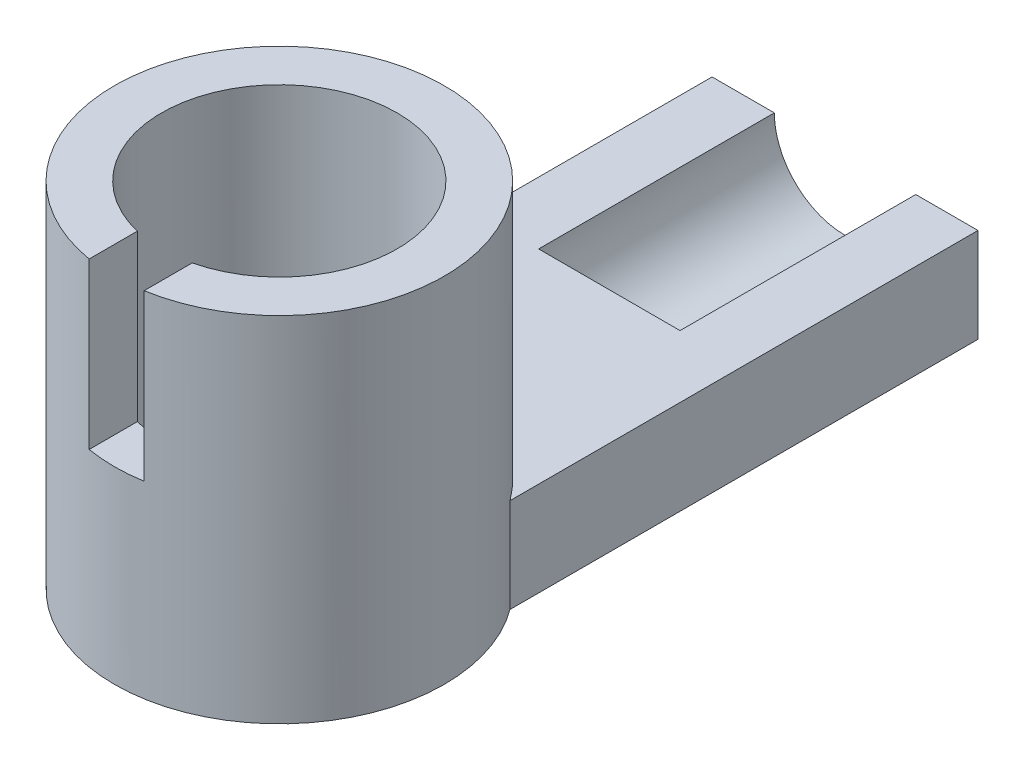
ISO-10303-21;
HEADER;
FILE_DESCRIPTION(('STEP AP214'),'2;1');
FILE_NAME('part.step','',(''),(''),'','','');
FILE_SCHEMA(('AUTOMOTIVE_DESIGN { 1 0 10303 214 1 1 1 1 }'));
ENDSEC;
DATA;
#1=APPLICATION_CONTEXT('core data for automotive mechanical design processes');
#2=APPLICATION_PROTOCOL_DEFINITION('international standard','automotive_design',2000,#1);
#3=PRODUCT_CONTEXT('',#1,'mechanical');
#4=PRODUCT('Part','Part','',(#3));
#5=PRODUCT_RELATED_PRODUCT_CATEGORY('part','',(#4));
#6=PRODUCT_DEFINITION_FORMATION('','',#4);
#7=PRODUCT_DEFINITION_CONTEXT('part definition',#1,'design');
#8=PRODUCT_DEFINITION('design','',#6,#7);
#9=PRODUCT_DEFINITION_SHAPE('','',#8);
#10=(LENGTH_UNIT() NAMED_UNIT(*) SI_UNIT(.MILLI.,.METRE.));
#11=(NAMED_UNIT(*) PLANE_ANGLE_UNIT() SI_UNIT($,.RADIAN.));
#12=(NAMED_UNIT(*) SI_UNIT($,.STERADIAN.) SOLID_ANGLE_UNIT());
#13=UNCERTAINTY_MEASURE_WITH_UNIT(LENGTH_MEASURE(1.E-05),#10,'distance_accuracy_value','');
#14=(GEOMETRIC_REPRESENTATION_CONTEXT(3) GLOBAL_UNCERTAINTY_ASSIGNED_CONTEXT((#13)) GLOBAL_UNIT_ASSIGNED_CONTEXT((#10,
#11,#12)) REPRESENTATION_CONTEXT('',''));
#15=CARTESIAN_POINT('',(0.,0.,0.));
#16=DIRECTION('',(0.,0.,1.));
#17=DIRECTION('',(1.,0.,0.));
#18=AXIS2_PLACEMENT_3D('',#15,#16,#17);
#19=CARTESIAN_POINT('',(0.,150000.,0.));
#20=DIRECTION('',(0.,1.,0.));
#21=DIRECTION('',(0.,0.,1.));
#22=AXIS2_PLACEMENT_3D('',#19,#20,#21);
#23=PLANE('',#22);
#24=CARTESIAN_POINT('',(0.,150000.,0.));
#25=DIRECTION('',(0.,1.,0.));
#26=DIRECTION('',(0.,0.,1.));
#27=AXIS2_PLACEMENT_3D('',#24,#25,#26);
#28=CIRCLE('',#27,50000.);
#29=CARTESIAN_POINT('',(11658.732966895,150000.,48621.74354758));
#30=VERTEX_POINT('',#29);
#31=CARTESIAN_POINT('',(-11658.732966895,150000.,48621.74354758));
#32=VERTEX_POINT('',#31);
#33=EDGE_CURVE('E172',#30,#32,#28,.T.);
#34=ORIENTED_EDGE('',*,*,#33,.F.);
#35=DIRECTION('',(0.,0.,1.));
#36=VECTOR('',#35,1.);
#37=CARTESIAN_POINT('',(11658.732966895,150000.,0.));
#38=LINE('',#37,#36);
#39=CARTESIAN_POINT('',(11658.732966895,150000.,69022.271373859));
#40=VERTEX_POINT('',#39);
#41=EDGE_CURVE('E129',#30,#40,#38,.T.);
#42=ORIENTED_EDGE('',*,*,#41,.T.);
#43=CARTESIAN_POINT('',(0.,150000.,0.));
#44=DIRECTION('',(0.,1.,0.));
#45=DIRECTION('',(0.,0.,1.));
#46=AXIS2_PLACEMENT_3D('',#43,#44,#45);
#47=CIRCLE('',#46,70000.);
#48=CARTESIAN_POINT('',(-11658.732966895,150000.,69022.271373859));
#49=VERTEX_POINT('',#48);
#50=EDGE_CURVE('E127',#40,#49,#47,.T.);
#51=ORIENTED_EDGE('',*,*,#50,.T.);
#52=DIRECTION('',(0.,0.,-1.));
#53=VECTOR('',#52,1.);
#54=CARTESIAN_POINT('',(-11658.732966895,150000.,0.));
#55=LINE('',#54,#53);
#56=EDGE_CURVE('E117',#49,#32,#55,.T.);
#57=ORIENTED_EDGE('',*,*,#56,.T.);
#58=EDGE_LOOP('',(#34,#42,#51,#57));
#59=FACE_BOUND('',#58,.T.);
#60=ADVANCED_FACE('F33',(#59),#23,.T.);
#61=CARTESIAN_POINT('',(0.,150000.,0.));
#62=DIRECTION('',(0.,-1.,0.));
#63=DIRECTION('',(0.,0.,-1.));
#64=AXIS2_PLACEMENT_3D('',#61,#62,#63);
#65=CYLINDRICAL_SURFACE('',#64,70000.);
#66=CARTESIAN_POINT('',(0.,40000.,0.));
#67=DIRECTION('',(0.,1.,0.));
#68=DIRECTION('',(0.,0.,1.));
#69=AXIS2_PLACEMENT_3D('',#66,#67,#68);
#70=CIRCLE('',#69,70000.);
#71=CARTESIAN_POINT('',(56411.2858654656,40000.,-41445.95067078));
#72=VERTEX_POINT('',#71);
#73=CARTESIAN_POINT('',(-56411.2858654656,40000.,-41445.95067078));
#74=VERTEX_POINT('',#73);
#75=EDGE_CURVE('E162',#72,#74,#70,.T.);
#76=ORIENTED_EDGE('',*,*,#75,.T.);
#77=DIRECTION('',(0.,-1.,0.));
#78=VECTOR('',#77,1.);
#79=CARTESIAN_POINT('',(-56411.2858654656,40000.,-41445.95067078));
#80=LINE('',#79,#78);
#81=CARTESIAN_POINT('',(-56411.2858654656,0.,-41445.95067078));
#82=VERTEX_POINT('',#81);
#83=EDGE_CURVE('E165',#74,#82,#80,.T.);
#84=ORIENTED_EDGE('',*,*,#83,.T.);
#85=CARTESIAN_POINT('',(0.,0.,0.));
#86=DIRECTION('',(0.,1.,0.));
#87=DIRECTION('',(0.,0.,1.));
#88=AXIS2_PLACEMENT_3D('',#85,#86,#87);
#89=CIRCLE('',#88,70000.);
#90=CARTESIAN_POINT('',(56411.2858654656,0.,-41445.95067078));
#91=VERTEX_POINT('',#90);
#92=EDGE_CURVE('E175',#82,#91,#89,.T.);
#93=ORIENTED_EDGE('',*,*,#92,.T.);
#94=DIRECTION('',(0.,-1.,0.));
#95=VECTOR('',#94,1.);
#96=CARTESIAN_POINT('',(56411.2858654656,40000.,-41445.95067078));
#97=LINE('',#96,#95);
#98=EDGE_CURVE('E152',#72,#91,#97,.T.);
#99=ORIENTED_EDGE('',*,*,#98,.F.);
#100=EDGE_LOOP('',(#76,#84,#93,#99));
#101=FACE_BOUND('',#100,.T.);
#102=DIRECTION('',(0.,-1.,0.));
#103=VECTOR('',#102,1.);
#104=CARTESIAN_POINT('',(11658.732966895,150000.,69022.271373859));
#105=LINE('',#104,#103);
#106=CARTESIAN_POINT('',(11658.732966895,79999.9999999998,69022.271373859));
#107=VERTEX_POINT('',#106);
#108=EDGE_CURVE('E121',#107,#40,#105,.F.);
#109=ORIENTED_EDGE('',*,*,#108,.F.);
#110=CARTESIAN_POINT('',(0.,79999.9999999998,0.));
#111=DIRECTION('',(0.,1.,0.));
#112=DIRECTION('',(0.,0.,1.));
#113=AXIS2_PLACEMENT_3D('',#110,#111,#112);
#114=CIRCLE('',#113,70000.);
#115=CARTESIAN_POINT('',(-11658.732966895,79999.9999999998,69022.271373859));
#116=VERTEX_POINT('',#115);
#117=EDGE_CURVE('E110',#116,#107,#114,.T.);
#118=ORIENTED_EDGE('',*,*,#117,.F.);
#119=DIRECTION('',(0.,-1.,0.));
#120=VECTOR('',#119,1.);
#121=CARTESIAN_POINT('',(-11658.732966895,150000.,69022.271373859));
#122=LINE('',#121,#120);
#123=EDGE_CURVE('E134',#49,#116,#122,.T.);
#124=ORIENTED_EDGE('',*,*,#123,.F.);
#125=ORIENTED_EDGE('',*,*,#50,.F.);
#126=EDGE_LOOP('',(#109,#118,#124,#125));
#127=FACE_BOUND('',#126,.T.);
#128=ADVANCED_FACE('F35',(#101,#127),#65,.T.);
#129=CARTESIAN_POINT('',(0.,150000.,0.));
#130=DIRECTION('',(0.,-1.,0.));
#131=DIRECTION('',(0.,0.,-1.));
#132=AXIS2_PLACEMENT_3D('',#129,#130,#131);
#133=CYLINDRICAL_SURFACE('',#132,50000.);
#134=CARTESIAN_POINT('',(0.,0.,0.));
#135=DIRECTION('',(0.,1.,0.));
#136=DIRECTION('',(0.,0.,1.));
#137=AXIS2_PLACEMENT_3D('',#134,#135,#136);
#138=CIRCLE('',#137,50000.);
#139=CARTESIAN_POINT('',(0.,0.,50000.));
#140=VERTEX_POINT('',#139);
#141=EDGE_CURVE('E171',#140,#140,#138,.T.);
#142=ORIENTED_EDGE('',*,*,#141,.F.);
#143=EDGE_LOOP('',(#142));
#144=FACE_BOUND('',#143,.T.);
#145=CARTESIAN_POINT('',(0.,79999.9999999998,0.));
#146=DIRECTION('',(0.,1.,0.));
#147=DIRECTION('',(0.,0.,1.));
#148=AXIS2_PLACEMENT_3D('',#145,#146,#147);
#149=CIRCLE('',#148,50000.);
#150=CARTESIAN_POINT('',(-11658.732966895,79999.9999999998,48621.74354758));
#151=VERTEX_POINT('',#150);
#152=CARTESIAN_POINT('',(11658.732966895,79999.9999999998,48621.74354758));
#153=VERTEX_POINT('',#152);
#154=EDGE_CURVE('E185',#151,#153,#149,.T.);
#155=ORIENTED_EDGE('',*,*,#154,.T.);
#156=DIRECTION('',(0.,-1.,0.));
#157=VECTOR('',#156,1.);
#158=CARTESIAN_POINT('',(11658.732966895,150000.,48621.74354758));
#159=LINE('',#158,#157);
#160=EDGE_CURVE('E11',#153,#30,#159,.F.);
#161=ORIENTED_EDGE('',*,*,#160,.T.);
#162=ORIENTED_EDGE('',*,*,#33,.T.);
#163=DIRECTION('',(0.,-1.,0.));
#164=VECTOR('',#163,1.);
#165=CARTESIAN_POINT('',(-11658.732966895,150000.,48621.74354758));
#166=LINE('',#165,#164);
#167=EDGE_CURVE('E41',#32,#151,#166,.T.);
#168=ORIENTED_EDGE('',*,*,#167,.T.);
#169=EDGE_LOOP('',(#155,#161,#162,#168));
#170=FACE_BOUND('',#169,.T.);
#171=ADVANCED_FACE('F188',(#144,#170),#133,.F.);
#172=CARTESIAN_POINT('',(0.,0.,0.));
#173=DIRECTION('',(0.,1.,0.));
#174=DIRECTION('',(0.,0.,1.));
#175=AXIS2_PLACEMENT_3D('',#172,#173,#174);
#176=PLANE('',#175);
#177=ORIENTED_EDGE('',*,*,#92,.F.);
#178=DIRECTION('',(0.,0.,-1.));
#179=VECTOR('',#178,1.);
#180=CARTESIAN_POINT('',(-56411.2858654656,0.,-240003.737633043));
#181=LINE('',#180,#179);
#182=CARTESIAN_POINT('',(-56411.2858654656,0.,-240003.737633043));
#183=VERTEX_POINT('',#182);
#184=EDGE_CURVE('E155',#82,#183,#181,.T.);
#185=ORIENTED_EDGE('',*,*,#184,.T.);
#186=DIRECTION('',(1.,0.,0.));
#187=VECTOR('',#186,1.);
#188=CARTESIAN_POINT('',(-56411.2858654656,0.,-240003.737633043));
#189=LINE('',#188,#187);
#190=CARTESIAN_POINT('',(56411.2858654656,0.,-240003.737633043));
#191=VERTEX_POINT('',#190);
#192=EDGE_CURVE('E145',#183,#191,#189,.T.);
#193=ORIENTED_EDGE('',*,*,#192,.T.);
#194=DIRECTION('',(0.,0.,1.));
#195=VECTOR('',#194,1.);
#196=CARTESIAN_POINT('',(56411.2858654656,0.,-240003.737633043));
#197=LINE('',#196,#195);
#198=EDGE_CURVE('E140',#191,#91,#197,.T.);
#199=ORIENTED_EDGE('',*,*,#198,.T.);
#200=EDGE_LOOP('',(#177,#185,#193,#199));
#201=FACE_BOUND('',#200,.T.);
#202=ORIENTED_EDGE('',*,*,#141,.T.);
#203=EDGE_LOOP('',(#202));
#204=FACE_BOUND('',#203,.T.);
#205=ADVANCED_FACE('F204',(#201,#204),#176,.F.);
#206=CARTESIAN_POINT('',(0.,40000.,0.));
#207=DIRECTION('',(0.,1.,0.));
#208=DIRECTION('',(0.,0.,1.));
#209=AXIS2_PLACEMENT_3D('',#206,#207,#208);
#210=PLANE('',#209);
#211=DIRECTION('',(0.,0.,-1.));
#212=VECTOR('',#211,1.);
#213=CARTESIAN_POINT('',(30000.,40000.,-140003.737633043));
#214=LINE('',#213,#212);
#215=CARTESIAN_POINT('',(30000.,40000.,-140003.737633043));
#216=VERTEX_POINT('',#215);
#217=CARTESIAN_POINT('',(30000.,40000.,-240003.737633043));
#218=VERTEX_POINT('',#217);
#219=EDGE_CURVE('E56',#216,#218,#214,.T.);
#220=ORIENTED_EDGE('',*,*,#219,.F.);
#221=DIRECTION('',(-1.,0.,0.));
#222=VECTOR('',#221,1.);
#223=CARTESIAN_POINT('',(0.,40000.,-140003.737633043));
#224=LINE('',#223,#222);
#225=CARTESIAN_POINT('',(-30000.,40000.,-140003.737633043));
#226=VERTEX_POINT('',#225);
#227=EDGE_CURVE('E182',#216,#226,#224,.T.);
#228=ORIENTED_EDGE('',*,*,#227,.T.);
#229=DIRECTION('',(0.,0.,-1.));
#230=VECTOR('',#229,1.);
#231=CARTESIAN_POINT('',(-30000.,40000.,-140003.737633043));
#232=LINE('',#231,#230);
#233=CARTESIAN_POINT('',(-30000.,40000.,-240003.737633043));
#234=VERTEX_POINT('',#233);
#235=EDGE_CURVE('E132',#234,#226,#232,.F.);
#236=ORIENTED_EDGE('',*,*,#235,.F.);
#237=DIRECTION('',(1.,0.,0.));
#238=VECTOR('',#237,1.);
#239=CARTESIAN_POINT('',(-56411.2858654656,40000.,-240003.737633043));
#240=LINE('',#239,#238);
#241=CARTESIAN_POINT('',(-56411.2858654656,40000.,-240003.737633043));
#242=VERTEX_POINT('',#241);
#243=EDGE_CURVE('E149',#242,#234,#240,.T.);
#244=ORIENTED_EDGE('',*,*,#243,.F.);
#245=DIRECTION('',(0.,0.,-1.));
#246=VECTOR('',#245,1.);
#247=CARTESIAN_POINT('',(-56411.2858654656,40000.,-240003.737633043));
#248=LINE('',#247,#246);
#249=EDGE_CURVE('E144',#74,#242,#248,.T.);
#250=ORIENTED_EDGE('',*,*,#249,.F.);
#251=ORIENTED_EDGE('',*,*,#75,.F.);
#252=DIRECTION('',(0.,0.,1.));
#253=VECTOR('',#252,1.);
#254=CARTESIAN_POINT('',(56411.2858654656,40000.,-240003.737633043));
#255=LINE('',#254,#253);
#256=CARTESIAN_POINT('',(56411.2858654656,40000.,-240003.737633043));
#257=VERTEX_POINT('',#256);
#258=EDGE_CURVE('E141',#257,#72,#255,.T.);
#259=ORIENTED_EDGE('',*,*,#258,.F.);
#260=EDGE_CURVE('E148',#218,#257,#240,.T.);
#261=ORIENTED_EDGE('',*,*,#260,.F.);
#262=EDGE_LOOP('',(#220,#228,#236,#244,#250,#251,#259,#261));
#263=FACE_BOUND('',#262,.T.);
#264=ADVANCED_FACE('F206',(#263),#210,.T.);
#265=CARTESIAN_POINT('',(56411.2858654656,40000.,-240003.737633043));
#266=DIRECTION('',(1.,0.,0.));
#267=DIRECTION('',(0.,0.,-1.));
#268=AXIS2_PLACEMENT_3D('',#265,#266,#267);
#269=PLANE('',#268);
#270=ORIENTED_EDGE('',*,*,#198,.F.);
#271=DIRECTION('',(0.,-1.,0.));
#272=VECTOR('',#271,1.);
#273=CARTESIAN_POINT('',(56411.2858654656,40000.,-240003.737633043));
#274=LINE('',#273,#272);
#275=EDGE_CURVE('E160',#257,#191,#274,.T.);
#276=ORIENTED_EDGE('',*,*,#275,.F.);
#277=ORIENTED_EDGE('',*,*,#258,.T.);
#278=ORIENTED_EDGE('',*,*,#98,.T.);
#279=EDGE_LOOP('',(#270,#276,#277,#278));
#280=FACE_BOUND('',#279,.T.);
#281=ADVANCED_FACE('F212',(#280),#269,.T.);
#282=CARTESIAN_POINT('',(-56411.2858654656,40000.,-240003.737633043));
#283=DIRECTION('',(0.,0.,-1.));
#284=DIRECTION('',(-1.,0.,0.));
#285=AXIS2_PLACEMENT_3D('',#282,#283,#284);
#286=PLANE('',#285);
#287=CARTESIAN_POINT('',(0.,40000.,-240003.737633043));
#288=DIRECTION('',(0.,0.,-1.));
#289=DIRECTION('',(-1.,0.,0.));
#290=AXIS2_PLACEMENT_3D('',#287,#288,#289);
#291=CIRCLE('',#290,30000.);
#292=EDGE_CURVE('E179',#218,#234,#291,.T.);
#293=ORIENTED_EDGE('',*,*,#292,.F.);
#294=ORIENTED_EDGE('',*,*,#260,.T.);
#295=ORIENTED_EDGE('',*,*,#275,.T.);
#296=ORIENTED_EDGE('',*,*,#192,.F.);
#297=DIRECTION('',(0.,-1.,0.));
#298=VECTOR('',#297,1.);
#299=CARTESIAN_POINT('',(-56411.2858654656,40000.,-240003.737633043));
#300=LINE('',#299,#298);
#301=EDGE_CURVE('E163',#242,#183,#300,.T.);
#302=ORIENTED_EDGE('',*,*,#301,.F.);
#303=ORIENTED_EDGE('',*,*,#243,.T.);
#304=EDGE_LOOP('',(#293,#294,#295,#296,#302,#303));
#305=FACE_BOUND('',#304,.T.);
#306=ADVANCED_FACE('F228',(#305),#286,.T.);
#307=CARTESIAN_POINT('',(-56411.2858654656,40000.,-240003.737633043));
#308=DIRECTION('',(-1.,0.,0.));
#309=DIRECTION('',(0.,0.,1.));
#310=AXIS2_PLACEMENT_3D('',#307,#308,#309);
#311=PLANE('',#310);
#312=ORIENTED_EDGE('',*,*,#184,.F.);
#313=ORIENTED_EDGE('',*,*,#83,.F.);
#314=ORIENTED_EDGE('',*,*,#249,.T.);
#315=ORIENTED_EDGE('',*,*,#301,.T.);
#316=EDGE_LOOP('',(#312,#313,#314,#315));
#317=FACE_BOUND('',#316,.T.);
#318=ADVANCED_FACE('F225',(#317),#311,.T.);
#319=CARTESIAN_POINT('',(0.,40000.,-140003.737633043));
#320=DIRECTION('',(0.,0.,-1.));
#321=DIRECTION('',(-1.,0.,0.));
#322=AXIS2_PLACEMENT_3D('',#319,#320,#321);
#323=CYLINDRICAL_SURFACE('',#322,30000.);
#324=ORIENTED_EDGE('',*,*,#219,.T.);
#325=ORIENTED_EDGE('',*,*,#292,.T.);
#326=ORIENTED_EDGE('',*,*,#235,.T.);
#327=CARTESIAN_POINT('',(0.,40000.,-140003.737633043));
#328=DIRECTION('',(0.,0.,-1.));
#329=DIRECTION('',(-1.,0.,0.));
#330=AXIS2_PLACEMENT_3D('',#327,#328,#329);
#331=CIRCLE('',#330,30000.);
#332=EDGE_CURVE('E128',#216,#226,#331,.T.);
#333=ORIENTED_EDGE('',*,*,#332,.F.);
#334=EDGE_LOOP('',(#324,#325,#326,#333));
#335=FACE_BOUND('',#334,.T.);
#336=ADVANCED_FACE('F234',(#335),#323,.F.);
#337=CARTESIAN_POINT('',(0.,40000.,-140003.737633043));
#338=DIRECTION('',(0.,0.,-1.));
#339=DIRECTION('',(-1.,0.,0.));
#340=AXIS2_PLACEMENT_3D('',#337,#338,#339);
#341=PLANE('',#340);
#342=ORIENTED_EDGE('',*,*,#332,.T.);
#343=ORIENTED_EDGE('',*,*,#227,.F.);
#344=EDGE_LOOP('',(#342,#343));
#345=FACE_BOUND('',#344,.T.);
#346=ADVANCED_FACE('F236',(#345),#341,.T.);
#347=CARTESIAN_POINT('',(11658.732966895,193724.,-20000.));
#348=DIRECTION('',(-1.,0.,0.));
#349=DIRECTION('',(0.,0.,1.));
#350=AXIS2_PLACEMENT_3D('',#347,#348,#349);
#351=PLANE('',#350);
#352=ORIENTED_EDGE('',*,*,#108,.T.);
#353=ORIENTED_EDGE('',*,*,#41,.F.);
#354=ORIENTED_EDGE('',*,*,#160,.F.);
#355=DIRECTION('',(0.,0.,-1.));
#356=VECTOR('',#355,1.);
#357=CARTESIAN_POINT('',(11658.732966895,79999.9999999998,-20000.));
#358=LINE('',#357,#356);
#359=EDGE_CURVE('E48',#107,#153,#358,.T.);
#360=ORIENTED_EDGE('',*,*,#359,.F.);
#361=EDGE_LOOP('',(#352,#353,#354,#360));
#362=FACE_BOUND('',#361,.T.);
#363=ADVANCED_FACE('F120',(#362),#351,.T.);
#364=CARTESIAN_POINT('',(-11658.732966895,193724.,-20000.));
#365=DIRECTION('',(1.,0.,0.));
#366=DIRECTION('',(0.,0.,-1.));
#367=AXIS2_PLACEMENT_3D('',#364,#365,#366);
#368=PLANE('',#367);
#369=ORIENTED_EDGE('',*,*,#123,.T.);
#370=DIRECTION('',(0.,0.,1.));
#371=VECTOR('',#370,1.);
#372=CARTESIAN_POINT('',(-11658.732966895,79999.9999999998,-20000.));
#373=LINE('',#372,#371);
#374=EDGE_CURVE('E113',#151,#116,#373,.T.);
#375=ORIENTED_EDGE('',*,*,#374,.F.);
#376=ORIENTED_EDGE('',*,*,#167,.F.);
#377=ORIENTED_EDGE('',*,*,#56,.F.);
#378=EDGE_LOOP('',(#369,#375,#376,#377));
#379=FACE_BOUND('',#378,.T.);
#380=ADVANCED_FACE('F192',(#379),#368,.T.);
#381=CARTESIAN_POINT('',(0.,79999.9999999998,0.));
#382=DIRECTION('',(0.,1.,0.));
#383=DIRECTION('',(0.,0.,1.));
#384=AXIS2_PLACEMENT_3D('',#381,#382,#383);
#385=PLANE('',#384);
#386=ORIENTED_EDGE('',*,*,#117,.T.);
#387=ORIENTED_EDGE('',*,*,#359,.T.);
#388=ORIENTED_EDGE('',*,*,#154,.F.);
#389=ORIENTED_EDGE('',*,*,#374,.T.);
#390=EDGE_LOOP('',(#386,#387,#388,#389));
#391=FACE_BOUND('',#390,.T.);
#392=ADVANCED_FACE('F111',(#391),#385,.T.);
#393=CLOSED_SHELL('',(#60,#128,#171,#205,#264,#281,#306,#318,#336,#346,#363,#380,#392));
#394=MANIFOLD_SOLID_BREP('B2',#393);
#395=ADVANCED_BREP_SHAPE_REPRESENTATION('',(#18,#394),#14);
#396=SHAPE_DEFINITION_REPRESENTATION(#9,#395);
ENDSEC;
END-ISO-10303-21;
